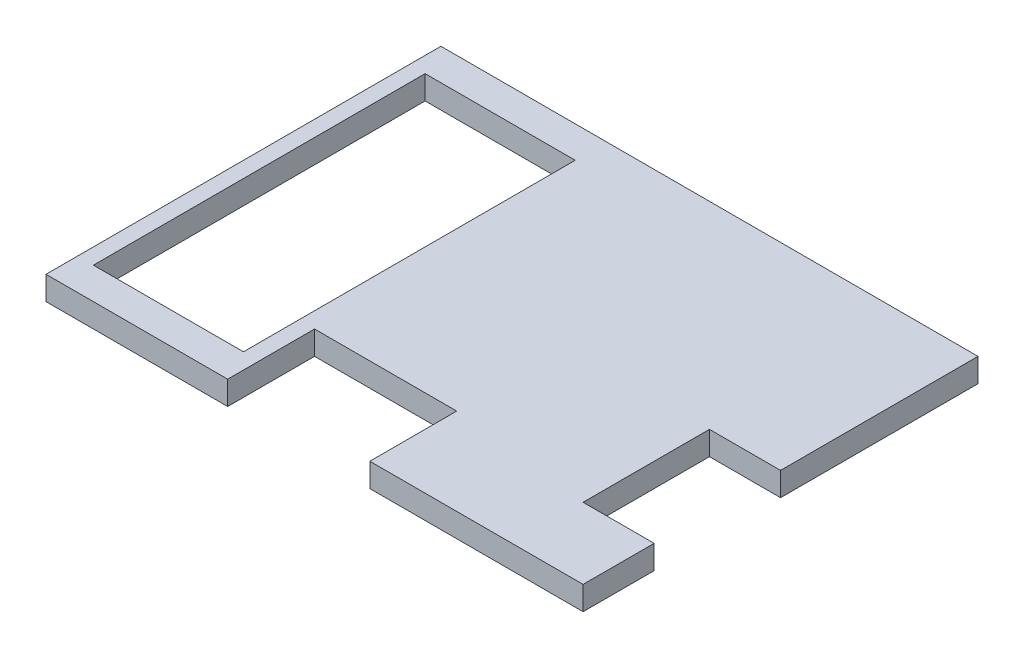
ISO-10303-21;
HEADER;
FILE_DESCRIPTION(('STEP AP214'),'2;1');
FILE_NAME('part.step','',(''),(''),'','','');
FILE_SCHEMA(('AUTOMOTIVE_DESIGN { 1 0 10303 214 1 1 1 1 }'));
ENDSEC;
DATA;
#1=APPLICATION_CONTEXT('core data for automotive mechanical design processes');
#2=APPLICATION_PROTOCOL_DEFINITION('international standard','automotive_design',2000,#1);
#3=PRODUCT_CONTEXT('',#1,'mechanical');
#4=PRODUCT('Part','Part','',(#3));
#5=PRODUCT_RELATED_PRODUCT_CATEGORY('part','',(#4));
#6=PRODUCT_DEFINITION_FORMATION('','',#4);
#7=PRODUCT_DEFINITION_CONTEXT('part definition',#1,'design');
#8=PRODUCT_DEFINITION('design','',#6,#7);
#9=PRODUCT_DEFINITION_SHAPE('','',#8);
#10=(LENGTH_UNIT() NAMED_UNIT(*) SI_UNIT(.MILLI.,.METRE.));
#11=(NAMED_UNIT(*) PLANE_ANGLE_UNIT() SI_UNIT($,.RADIAN.));
#12=(NAMED_UNIT(*) SI_UNIT($,.STERADIAN.) SOLID_ANGLE_UNIT());
#13=UNCERTAINTY_MEASURE_WITH_UNIT(LENGTH_MEASURE(1.E-05),#10,'distance_accuracy_value','');
#14=(GEOMETRIC_REPRESENTATION_CONTEXT(3) GLOBAL_UNCERTAINTY_ASSIGNED_CONTEXT((#13)) GLOBAL_UNIT_ASSIGNED_CONTEXT((#10,
#11,#12)) REPRESENTATION_CONTEXT('',''));
#15=CARTESIAN_POINT('',(0.,0.,0.));
#16=DIRECTION('',(0.,0.,1.));
#17=DIRECTION('',(1.,0.,0.));
#18=AXIS2_PLACEMENT_3D('',#15,#16,#17);
#19=CARTESIAN_POINT('',(0.,3.,0.));
#20=DIRECTION('',(0.,1.,0.));
#21=DIRECTION('',(0.,0.,1.));
#22=AXIS2_PLACEMENT_3D('',#19,#20,#21);
#23=PLANE('',#22);
#24=DIRECTION('',(0.,0.,-1.));
#25=VECTOR('',#24,1.);
#26=CARTESIAN_POINT('',(34.,3.,16.));
#27=LINE('',#26,#25);
#28=CARTESIAN_POINT('',(34.,3.,25.));
#29=VERTEX_POINT('',#28);
#30=CARTESIAN_POINT('',(34.,3.,16.));
#31=VERTEX_POINT('',#30);
#32=EDGE_CURVE('E182',#29,#31,#27,.T.);
#33=ORIENTED_EDGE('',*,*,#32,.T.);
#34=DIRECTION('',(-1.,0.,0.));
#35=VECTOR('',#34,1.);
#36=CARTESIAN_POINT('',(34.,3.,16.));
#37=LINE('',#36,#35);
#38=CARTESIAN_POINT('',(25.,3.,16.));
#39=VERTEX_POINT('',#38);
#40=EDGE_CURVE('E185',#31,#39,#37,.T.);
#41=ORIENTED_EDGE('',*,*,#40,.T.);
#42=DIRECTION('',(0.,0.,-1.));
#43=VECTOR('',#42,1.);
#44=CARTESIAN_POINT('',(25.,3.,0.));
#45=LINE('',#44,#43);
#46=CARTESIAN_POINT('',(25.,3.,0.));
#47=VERTEX_POINT('',#46);
#48=EDGE_CURVE('E188',#39,#47,#45,.T.);
#49=ORIENTED_EDGE('',*,*,#48,.T.);
#50=DIRECTION('',(1.,0.,0.));
#51=VECTOR('',#50,1.);
#52=CARTESIAN_POINT('',(34.,3.,0.));
#53=LINE('',#52,#51);
#54=CARTESIAN_POINT('',(34.,3.,0.));
#55=VERTEX_POINT('',#54);
#56=EDGE_CURVE('E190',#47,#55,#53,.T.);
#57=ORIENTED_EDGE('',*,*,#56,.T.);
#58=DIRECTION('',(0.,0.,-1.));
#59=VECTOR('',#58,1.);
#60=CARTESIAN_POINT('',(34.,3.,-25.));
#61=LINE('',#60,#59);
#62=CARTESIAN_POINT('',(34.,3.,-25.));
#63=VERTEX_POINT('',#62);
#64=EDGE_CURVE('E192',#55,#63,#61,.T.);
#65=ORIENTED_EDGE('',*,*,#64,.T.);
#66=DIRECTION('',(-1.,0.,0.));
#67=VECTOR('',#66,1.);
#68=CARTESIAN_POINT('',(-34.,3.,-25.));
#69=LINE('',#68,#67);
#70=CARTESIAN_POINT('',(-34.,3.,-25.));
#71=VERTEX_POINT('',#70);
#72=EDGE_CURVE('E194',#63,#71,#69,.T.);
#73=ORIENTED_EDGE('',*,*,#72,.T.);
#74=DIRECTION('',(0.,0.,1.));
#75=VECTOR('',#74,1.);
#76=CARTESIAN_POINT('',(-34.,3.,-25.));
#77=LINE('',#76,#75);
#78=CARTESIAN_POINT('',(-34.,3.,25.));
#79=VERTEX_POINT('',#78);
#80=EDGE_CURVE('E196',#71,#79,#77,.T.);
#81=ORIENTED_EDGE('',*,*,#80,.T.);
#82=DIRECTION('',(1.,0.,0.));
#83=VECTOR('',#82,1.);
#84=CARTESIAN_POINT('',(-34.,3.,25.));
#85=LINE('',#84,#83);
#86=CARTESIAN_POINT('',(-11.,3.,25.));
#87=VERTEX_POINT('',#86);
#88=EDGE_CURVE('E198',#79,#87,#85,.T.);
#89=ORIENTED_EDGE('',*,*,#88,.T.);
#90=DIRECTION('',(0.,0.,-1.));
#91=VECTOR('',#90,1.);
#92=CARTESIAN_POINT('',(-11.,3.,25.));
#93=LINE('',#92,#91);
#94=CARTESIAN_POINT('',(-11.,3.,14.));
#95=VERTEX_POINT('',#94);
#96=EDGE_CURVE('E200',#87,#95,#93,.T.);
#97=ORIENTED_EDGE('',*,*,#96,.T.);
#98=DIRECTION('',(1.,0.,0.));
#99=VECTOR('',#98,1.);
#100=CARTESIAN_POINT('',(7.,3.,14.));
#101=LINE('',#100,#99);
#102=CARTESIAN_POINT('',(7.,3.,14.));
#103=VERTEX_POINT('',#102);
#104=EDGE_CURVE('E202',#95,#103,#101,.T.);
#105=ORIENTED_EDGE('',*,*,#104,.T.);
#106=DIRECTION('',(0.,0.,1.));
#107=VECTOR('',#106,1.);
#108=CARTESIAN_POINT('',(7.,3.,25.));
#109=LINE('',#108,#107);
#110=CARTESIAN_POINT('',(7.,3.,25.));
#111=VERTEX_POINT('',#110);
#112=EDGE_CURVE('E204',#103,#111,#109,.T.);
#113=ORIENTED_EDGE('',*,*,#112,.T.);
#114=DIRECTION('',(1.,0.,0.));
#115=VECTOR('',#114,1.);
#116=CARTESIAN_POINT('',(7.,3.,25.));
#117=LINE('',#116,#115);
#118=EDGE_CURVE('E206',#111,#29,#117,.T.);
#119=ORIENTED_EDGE('',*,*,#118,.T.);
#120=EDGE_LOOP('',(#33,#41,#49,#57,#65,#73,#81,#89,#97,#105,#113,#119));
#121=FACE_BOUND('',#120,.T.);
#122=DIRECTION('',(-1.,0.,0.));
#123=VECTOR('',#122,1.);
#124=CARTESIAN_POINT('',(-32.,3.,-21.));
#125=LINE('',#124,#123);
#126=CARTESIAN_POINT('',(-13.,3.,-21.));
#127=VERTEX_POINT('',#126);
#128=CARTESIAN_POINT('',(-32.,3.,-21.));
#129=VERTEX_POINT('',#128);
#130=EDGE_CURVE('E154',#127,#129,#125,.T.);
#131=ORIENTED_EDGE('',*,*,#130,.F.);
#132=DIRECTION('',(0.,0.,-1.));
#133=VECTOR('',#132,1.);
#134=CARTESIAN_POINT('',(-13.,3.,-21.));
#135=LINE('',#134,#133);
#136=CARTESIAN_POINT('',(-13.,3.,21.));
#137=VERTEX_POINT('',#136);
#138=EDGE_CURVE('E146',#137,#127,#135,.T.);
#139=ORIENTED_EDGE('',*,*,#138,.F.);
#140=DIRECTION('',(1.,0.,0.));
#141=VECTOR('',#140,1.);
#142=CARTESIAN_POINT('',(-32.,3.,21.));
#143=LINE('',#142,#141);
#144=CARTESIAN_POINT('',(-32.,3.,21.));
#145=VERTEX_POINT('',#144);
#146=EDGE_CURVE('E168',#145,#137,#143,.T.);
#147=ORIENTED_EDGE('',*,*,#146,.F.);
#148=DIRECTION('',(0.,0.,1.));
#149=VECTOR('',#148,1.);
#150=CARTESIAN_POINT('',(-32.,3.,-21.));
#151=LINE('',#150,#149);
#152=EDGE_CURVE('E166',#129,#145,#151,.T.);
#153=ORIENTED_EDGE('',*,*,#152,.F.);
#154=EDGE_LOOP('',(#131,#139,#147,#153));
#155=FACE_BOUND('',#154,.T.);
#156=ADVANCED_FACE('F33',(#121,#155),#23,.T.);
#157=CARTESIAN_POINT('',(0.,0.,0.));
#158=DIRECTION('',(0.,1.,0.));
#159=DIRECTION('',(0.,0.,1.));
#160=AXIS2_PLACEMENT_3D('',#157,#158,#159);
#161=PLANE('',#160);
#162=DIRECTION('',(0.,0.,-1.));
#163=VECTOR('',#162,1.);
#164=CARTESIAN_POINT('',(34.,0.,16.));
#165=LINE('',#164,#163);
#166=CARTESIAN_POINT('',(34.,0.,25.));
#167=VERTEX_POINT('',#166);
#168=CARTESIAN_POINT('',(34.,0.,16.));
#169=VERTEX_POINT('',#168);
#170=EDGE_CURVE('E162',#167,#169,#165,.T.);
#171=ORIENTED_EDGE('',*,*,#170,.F.);
#172=DIRECTION('',(1.,0.,0.));
#173=VECTOR('',#172,1.);
#174=CARTESIAN_POINT('',(7.,0.,25.));
#175=LINE('',#174,#173);
#176=CARTESIAN_POINT('',(7.,0.,25.));
#177=VERTEX_POINT('',#176);
#178=EDGE_CURVE('E186',#177,#167,#175,.T.);
#179=ORIENTED_EDGE('',*,*,#178,.F.);
#180=DIRECTION('',(0.,0.,1.));
#181=VECTOR('',#180,1.);
#182=CARTESIAN_POINT('',(7.,0.,25.));
#183=LINE('',#182,#181);
#184=CARTESIAN_POINT('',(7.,0.,14.));
#185=VERTEX_POINT('',#184);
#186=EDGE_CURVE('E229',#185,#177,#183,.T.);
#187=ORIENTED_EDGE('',*,*,#186,.F.);
#188=DIRECTION('',(1.,0.,0.));
#189=VECTOR('',#188,1.);
#190=CARTESIAN_POINT('',(7.,0.,14.));
#191=LINE('',#190,#189);
#192=CARTESIAN_POINT('',(-11.,0.,14.));
#193=VERTEX_POINT('',#192);
#194=EDGE_CURVE('E227',#193,#185,#191,.T.);
#195=ORIENTED_EDGE('',*,*,#194,.F.);
#196=DIRECTION('',(0.,0.,-1.));
#197=VECTOR('',#196,1.);
#198=CARTESIAN_POINT('',(-11.,0.,25.));
#199=LINE('',#198,#197);
#200=CARTESIAN_POINT('',(-11.,0.,25.));
#201=VERTEX_POINT('',#200);
#202=EDGE_CURVE('E225',#201,#193,#199,.T.);
#203=ORIENTED_EDGE('',*,*,#202,.F.);
#204=DIRECTION('',(1.,0.,0.));
#205=VECTOR('',#204,1.);
#206=CARTESIAN_POINT('',(-34.,0.,25.));
#207=LINE('',#206,#205);
#208=CARTESIAN_POINT('',(-34.,0.,25.));
#209=VERTEX_POINT('',#208);
#210=EDGE_CURVE('E223',#209,#201,#207,.T.);
#211=ORIENTED_EDGE('',*,*,#210,.F.);
#212=DIRECTION('',(0.,0.,1.));
#213=VECTOR('',#212,1.);
#214=CARTESIAN_POINT('',(-34.,0.,-25.));
#215=LINE('',#214,#213);
#216=CARTESIAN_POINT('',(-34.,0.,-25.));
#217=VERTEX_POINT('',#216);
#218=EDGE_CURVE('E221',#217,#209,#215,.T.);
#219=ORIENTED_EDGE('',*,*,#218,.F.);
#220=DIRECTION('',(-1.,0.,0.));
#221=VECTOR('',#220,1.);
#222=CARTESIAN_POINT('',(-34.,0.,-25.));
#223=LINE('',#222,#221);
#224=CARTESIAN_POINT('',(34.,0.,-25.));
#225=VERTEX_POINT('',#224);
#226=EDGE_CURVE('E219',#225,#217,#223,.T.);
#227=ORIENTED_EDGE('',*,*,#226,.F.);
#228=DIRECTION('',(0.,0.,-1.));
#229=VECTOR('',#228,1.);
#230=CARTESIAN_POINT('',(34.,0.,-25.));
#231=LINE('',#230,#229);
#232=CARTESIAN_POINT('',(34.,0.,0.));
#233=VERTEX_POINT('',#232);
#234=EDGE_CURVE('E217',#233,#225,#231,.T.);
#235=ORIENTED_EDGE('',*,*,#234,.F.);
#236=DIRECTION('',(1.,0.,0.));
#237=VECTOR('',#236,1.);
#238=CARTESIAN_POINT('',(34.,0.,0.));
#239=LINE('',#238,#237);
#240=CARTESIAN_POINT('',(25.,0.,0.));
#241=VERTEX_POINT('',#240);
#242=EDGE_CURVE('E215',#241,#233,#239,.T.);
#243=ORIENTED_EDGE('',*,*,#242,.F.);
#244=DIRECTION('',(0.,0.,-1.));
#245=VECTOR('',#244,1.);
#246=CARTESIAN_POINT('',(25.,0.,0.));
#247=LINE('',#246,#245);
#248=CARTESIAN_POINT('',(25.,0.,16.));
#249=VERTEX_POINT('',#248);
#250=EDGE_CURVE('E213',#249,#241,#247,.T.);
#251=ORIENTED_EDGE('',*,*,#250,.F.);
#252=DIRECTION('',(-1.,0.,0.));
#253=VECTOR('',#252,1.);
#254=CARTESIAN_POINT('',(34.,0.,16.));
#255=LINE('',#254,#253);
#256=EDGE_CURVE('E211',#169,#249,#255,.T.);
#257=ORIENTED_EDGE('',*,*,#256,.F.);
#258=EDGE_LOOP('',(#171,#179,#187,#195,#203,#211,#219,#227,#235,#243,#251,#257));
#259=FACE_BOUND('',#258,.T.);
#260=DIRECTION('',(0.,0.,-1.));
#261=VECTOR('',#260,1.);
#262=CARTESIAN_POINT('',(-13.,0.,-21.));
#263=LINE('',#262,#261);
#264=CARTESIAN_POINT('',(-13.,0.,21.));
#265=VERTEX_POINT('',#264);
#266=CARTESIAN_POINT('',(-13.,0.,-21.));
#267=VERTEX_POINT('',#266);
#268=EDGE_CURVE('E56',#265,#267,#263,.T.);
#269=ORIENTED_EDGE('',*,*,#268,.T.);
#270=DIRECTION('',(-1.,0.,0.));
#271=VECTOR('',#270,1.);
#272=CARTESIAN_POINT('',(-32.,0.,-21.));
#273=LINE('',#272,#271);
#274=CARTESIAN_POINT('',(-32.,0.,-21.));
#275=VERTEX_POINT('',#274);
#276=EDGE_CURVE('E161',#267,#275,#273,.T.);
#277=ORIENTED_EDGE('',*,*,#276,.T.);
#278=DIRECTION('',(0.,0.,1.));
#279=VECTOR('',#278,1.);
#280=CARTESIAN_POINT('',(-32.,0.,-21.));
#281=LINE('',#280,#279);
#282=CARTESIAN_POINT('',(-32.,0.,21.));
#283=VERTEX_POINT('',#282);
#284=EDGE_CURVE('E174',#275,#283,#281,.T.);
#285=ORIENTED_EDGE('',*,*,#284,.T.);
#286=DIRECTION('',(1.,0.,0.));
#287=VECTOR('',#286,1.);
#288=CARTESIAN_POINT('',(-32.,0.,21.));
#289=LINE('',#288,#287);
#290=EDGE_CURVE('E155',#283,#265,#289,.T.);
#291=ORIENTED_EDGE('',*,*,#290,.T.);
#292=EDGE_LOOP('',(#269,#277,#285,#291));
#293=FACE_BOUND('',#292,.T.);
#294=ADVANCED_FACE('F271',(#259,#293),#161,.F.);
#295=CARTESIAN_POINT('',(34.,3.,16.));
#296=DIRECTION('',(-1.,0.,0.));
#297=DIRECTION('',(0.,0.,1.));
#298=AXIS2_PLACEMENT_3D('',#295,#296,#297);
#299=PLANE('',#298);
#300=ORIENTED_EDGE('',*,*,#170,.T.);
#301=DIRECTION('',(0.,-1.,0.));
#302=VECTOR('',#301,1.);
#303=CARTESIAN_POINT('',(34.,3.,16.));
#304=LINE('',#303,#302);
#305=EDGE_CURVE('E11',#31,#169,#304,.T.);
#306=ORIENTED_EDGE('',*,*,#305,.F.);
#307=ORIENTED_EDGE('',*,*,#32,.F.);
#308=DIRECTION('',(0.,-1.,0.));
#309=VECTOR('',#308,1.);
#310=CARTESIAN_POINT('',(34.,3.,25.));
#311=LINE('',#310,#309);
#312=EDGE_CURVE('E208',#29,#167,#311,.T.);
#313=ORIENTED_EDGE('',*,*,#312,.T.);
#314=EDGE_LOOP('',(#300,#306,#307,#313));
#315=FACE_BOUND('',#314,.T.);
#316=ADVANCED_FACE('F35',(#315),#299,.F.);
#317=CARTESIAN_POINT('',(34.,3.,16.));
#318=DIRECTION('',(0.,0.,1.));
#319=DIRECTION('',(1.,0.,0.));
#320=AXIS2_PLACEMENT_3D('',#317,#318,#319);
#321=PLANE('',#320);
#322=ORIENTED_EDGE('',*,*,#256,.T.);
#323=DIRECTION('',(0.,-1.,0.));
#324=VECTOR('',#323,1.);
#325=CARTESIAN_POINT('',(25.,3.,16.));
#326=LINE('',#325,#324);
#327=EDGE_CURVE('E41',#39,#249,#326,.T.);
#328=ORIENTED_EDGE('',*,*,#327,.F.);
#329=ORIENTED_EDGE('',*,*,#40,.F.);
#330=ORIENTED_EDGE('',*,*,#305,.T.);
#331=EDGE_LOOP('',(#322,#328,#329,#330));
#332=FACE_BOUND('',#331,.T.);
#333=ADVANCED_FACE('F288',(#332),#321,.F.);
#334=CARTESIAN_POINT('',(25.,3.,0.));
#335=DIRECTION('',(-1.,0.,0.));
#336=DIRECTION('',(0.,0.,1.));
#337=AXIS2_PLACEMENT_3D('',#334,#335,#336);
#338=PLANE('',#337);
#339=ORIENTED_EDGE('',*,*,#250,.T.);
#340=DIRECTION('',(0.,-1.,0.));
#341=VECTOR('',#340,1.);
#342=CARTESIAN_POINT('',(25.,3.,0.));
#343=LINE('',#342,#341);
#344=EDGE_CURVE('E258',#47,#241,#343,.T.);
#345=ORIENTED_EDGE('',*,*,#344,.F.);
#346=ORIENTED_EDGE('',*,*,#48,.F.);
#347=ORIENTED_EDGE('',*,*,#327,.T.);
#348=EDGE_LOOP('',(#339,#345,#346,#347));
#349=FACE_BOUND('',#348,.T.);
#350=ADVANCED_FACE('F265',(#349),#338,.F.);
#351=CARTESIAN_POINT('',(34.,3.,0.));
#352=DIRECTION('',(0.,0.,-1.));
#353=DIRECTION('',(-1.,0.,0.));
#354=AXIS2_PLACEMENT_3D('',#351,#352,#353);
#355=PLANE('',#354);
#356=ORIENTED_EDGE('',*,*,#242,.T.);
#357=DIRECTION('',(0.,-1.,0.));
#358=VECTOR('',#357,1.);
#359=CARTESIAN_POINT('',(34.,3.,0.));
#360=LINE('',#359,#358);
#361=EDGE_CURVE('E255',#55,#233,#360,.T.);
#362=ORIENTED_EDGE('',*,*,#361,.F.);
#363=ORIENTED_EDGE('',*,*,#56,.F.);
#364=ORIENTED_EDGE('',*,*,#344,.T.);
#365=EDGE_LOOP('',(#356,#362,#363,#364));
#366=FACE_BOUND('',#365,.T.);
#367=ADVANCED_FACE('F277',(#366),#355,.F.);
#368=CARTESIAN_POINT('',(34.,3.,-25.));
#369=DIRECTION('',(-1.,0.,0.));
#370=DIRECTION('',(0.,0.,1.));
#371=AXIS2_PLACEMENT_3D('',#368,#369,#370);
#372=PLANE('',#371);
#373=ORIENTED_EDGE('',*,*,#234,.T.);
#374=DIRECTION('',(0.,-1.,0.));
#375=VECTOR('',#374,1.);
#376=CARTESIAN_POINT('',(34.,3.,-25.));
#377=LINE('',#376,#375);
#378=EDGE_CURVE('E252',#63,#225,#377,.T.);
#379=ORIENTED_EDGE('',*,*,#378,.F.);
#380=ORIENTED_EDGE('',*,*,#64,.F.);
#381=ORIENTED_EDGE('',*,*,#361,.T.);
#382=EDGE_LOOP('',(#373,#379,#380,#381));
#383=FACE_BOUND('',#382,.T.);
#384=ADVANCED_FACE('F281',(#383),#372,.F.);
#385=CARTESIAN_POINT('',(-34.,3.,-25.));
#386=DIRECTION('',(0.,0.,1.));
#387=DIRECTION('',(1.,0.,0.));
#388=AXIS2_PLACEMENT_3D('',#385,#386,#387);
#389=PLANE('',#388);
#390=ORIENTED_EDGE('',*,*,#226,.T.);
#391=DIRECTION('',(0.,-1.,0.));
#392=VECTOR('',#391,1.);
#393=CARTESIAN_POINT('',(-34.,3.,-25.));
#394=LINE('',#393,#392);
#395=EDGE_CURVE('E249',#71,#217,#394,.T.);
#396=ORIENTED_EDGE('',*,*,#395,.F.);
#397=ORIENTED_EDGE('',*,*,#72,.F.);
#398=ORIENTED_EDGE('',*,*,#378,.T.);
#399=EDGE_LOOP('',(#390,#396,#397,#398));
#400=FACE_BOUND('',#399,.T.);
#401=ADVANCED_FACE('F321',(#400),#389,.F.);
#402=CARTESIAN_POINT('',(-34.,3.,-25.));
#403=DIRECTION('',(1.,0.,0.));
#404=DIRECTION('',(0.,0.,-1.));
#405=AXIS2_PLACEMENT_3D('',#402,#403,#404);
#406=PLANE('',#405);
#407=ORIENTED_EDGE('',*,*,#218,.T.);
#408=DIRECTION('',(0.,-1.,0.));
#409=VECTOR('',#408,1.);
#410=CARTESIAN_POINT('',(-34.,3.,25.));
#411=LINE('',#410,#409);
#412=EDGE_CURVE('E246',#79,#209,#411,.T.);
#413=ORIENTED_EDGE('',*,*,#412,.F.);
#414=ORIENTED_EDGE('',*,*,#80,.F.);
#415=ORIENTED_EDGE('',*,*,#395,.T.);
#416=EDGE_LOOP('',(#407,#413,#414,#415));
#417=FACE_BOUND('',#416,.T.);
#418=ADVANCED_FACE('F319',(#417),#406,.F.);
#419=CARTESIAN_POINT('',(-34.,3.,25.));
#420=DIRECTION('',(0.,0.,-1.));
#421=DIRECTION('',(-1.,0.,0.));
#422=AXIS2_PLACEMENT_3D('',#419,#420,#421);
#423=PLANE('',#422);
#424=ORIENTED_EDGE('',*,*,#210,.T.);
#425=DIRECTION('',(0.,-1.,0.));
#426=VECTOR('',#425,1.);
#427=CARTESIAN_POINT('',(-11.,3.,25.));
#428=LINE('',#427,#426);
#429=EDGE_CURVE('E243',#87,#201,#428,.T.);
#430=ORIENTED_EDGE('',*,*,#429,.F.);
#431=ORIENTED_EDGE('',*,*,#88,.F.);
#432=ORIENTED_EDGE('',*,*,#412,.T.);
#433=EDGE_LOOP('',(#424,#430,#431,#432));
#434=FACE_BOUND('',#433,.T.);
#435=ADVANCED_FACE('F315',(#434),#423,.F.);
#436=CARTESIAN_POINT('',(-11.,3.,25.));
#437=DIRECTION('',(-1.,0.,0.));
#438=DIRECTION('',(0.,0.,1.));
#439=AXIS2_PLACEMENT_3D('',#436,#437,#438);
#440=PLANE('',#439);
#441=ORIENTED_EDGE('',*,*,#202,.T.);
#442=DIRECTION('',(0.,-1.,0.));
#443=VECTOR('',#442,1.);
#444=CARTESIAN_POINT('',(-11.,3.,14.));
#445=LINE('',#444,#443);
#446=EDGE_CURVE('E240',#95,#193,#445,.T.);
#447=ORIENTED_EDGE('',*,*,#446,.F.);
#448=ORIENTED_EDGE('',*,*,#96,.F.);
#449=ORIENTED_EDGE('',*,*,#429,.T.);
#450=EDGE_LOOP('',(#441,#447,#448,#449));
#451=FACE_BOUND('',#450,.T.);
#452=ADVANCED_FACE('F310',(#451),#440,.F.);
#453=CARTESIAN_POINT('',(7.,3.,14.));
#454=DIRECTION('',(0.,0.,-1.));
#455=DIRECTION('',(-1.,0.,0.));
#456=AXIS2_PLACEMENT_3D('',#453,#454,#455);
#457=PLANE('',#456);
#458=ORIENTED_EDGE('',*,*,#194,.T.);
#459=DIRECTION('',(0.,-1.,0.));
#460=VECTOR('',#459,1.);
#461=CARTESIAN_POINT('',(7.,3.,14.));
#462=LINE('',#461,#460);
#463=EDGE_CURVE('E237',#103,#185,#462,.T.);
#464=ORIENTED_EDGE('',*,*,#463,.F.);
#465=ORIENTED_EDGE('',*,*,#104,.F.);
#466=ORIENTED_EDGE('',*,*,#446,.T.);
#467=EDGE_LOOP('',(#458,#464,#465,#466));
#468=FACE_BOUND('',#467,.T.);
#469=ADVANCED_FACE('F304',(#468),#457,.F.);
#470=CARTESIAN_POINT('',(7.,3.,25.));
#471=DIRECTION('',(1.,0.,0.));
#472=DIRECTION('',(0.,0.,-1.));
#473=AXIS2_PLACEMENT_3D('',#470,#471,#472);
#474=PLANE('',#473);
#475=ORIENTED_EDGE('',*,*,#186,.T.);
#476=DIRECTION('',(0.,-1.,0.));
#477=VECTOR('',#476,1.);
#478=CARTESIAN_POINT('',(7.,3.,25.));
#479=LINE('',#478,#477);
#480=EDGE_CURVE('E234',#111,#177,#479,.T.);
#481=ORIENTED_EDGE('',*,*,#480,.F.);
#482=ORIENTED_EDGE('',*,*,#112,.F.);
#483=ORIENTED_EDGE('',*,*,#463,.T.);
#484=EDGE_LOOP('',(#475,#481,#482,#483));
#485=FACE_BOUND('',#484,.T.);
#486=ADVANCED_FACE('F300',(#485),#474,.F.);
#487=CARTESIAN_POINT('',(7.,3.,25.));
#488=DIRECTION('',(0.,0.,-1.));
#489=DIRECTION('',(-1.,0.,0.));
#490=AXIS2_PLACEMENT_3D('',#487,#488,#489);
#491=PLANE('',#490);
#492=ORIENTED_EDGE('',*,*,#178,.T.);
#493=ORIENTED_EDGE('',*,*,#312,.F.);
#494=ORIENTED_EDGE('',*,*,#118,.F.);
#495=ORIENTED_EDGE('',*,*,#480,.T.);
#496=EDGE_LOOP('',(#492,#493,#494,#495));
#497=FACE_BOUND('',#496,.T.);
#498=ADVANCED_FACE('F295',(#497),#491,.F.);
#499=CARTESIAN_POINT('',(-13.,3.,-21.));
#500=DIRECTION('',(-1.,0.,0.));
#501=DIRECTION('',(0.,0.,1.));
#502=AXIS2_PLACEMENT_3D('',#499,#500,#501);
#503=PLANE('',#502);
#504=ORIENTED_EDGE('',*,*,#268,.F.);
#505=DIRECTION('',(0.,-1.,0.));
#506=VECTOR('',#505,1.);
#507=CARTESIAN_POINT('',(-13.,3.,21.));
#508=LINE('',#507,#506);
#509=EDGE_CURVE('E150',#137,#265,#508,.T.);
#510=ORIENTED_EDGE('',*,*,#509,.F.);
#511=ORIENTED_EDGE('',*,*,#138,.T.);
#512=DIRECTION('',(0.,-1.,0.));
#513=VECTOR('',#512,1.);
#514=CARTESIAN_POINT('',(-13.,3.,-21.));
#515=LINE('',#514,#513);
#516=EDGE_CURVE('E149',#127,#267,#515,.T.);
#517=ORIENTED_EDGE('',*,*,#516,.T.);
#518=EDGE_LOOP('',(#504,#510,#511,#517));
#519=FACE_BOUND('',#518,.T.);
#520=ADVANCED_FACE('F148',(#519),#503,.T.);
#521=CARTESIAN_POINT('',(-32.,3.,-21.));
#522=DIRECTION('',(0.,0.,1.));
#523=DIRECTION('',(1.,0.,0.));
#524=AXIS2_PLACEMENT_3D('',#521,#522,#523);
#525=PLANE('',#524);
#526=ORIENTED_EDGE('',*,*,#276,.F.);
#527=ORIENTED_EDGE('',*,*,#516,.F.);
#528=ORIENTED_EDGE('',*,*,#130,.T.);
#529=DIRECTION('',(0.,-1.,0.));
#530=VECTOR('',#529,1.);
#531=CARTESIAN_POINT('',(-32.,3.,-21.));
#532=LINE('',#531,#530);
#533=EDGE_CURVE('E163',#129,#275,#532,.T.);
#534=ORIENTED_EDGE('',*,*,#533,.T.);
#535=EDGE_LOOP('',(#526,#527,#528,#534));
#536=FACE_BOUND('',#535,.T.);
#537=ADVANCED_FACE('F158',(#536),#525,.T.);
#538=CARTESIAN_POINT('',(-32.,3.,-21.));
#539=DIRECTION('',(1.,0.,0.));
#540=DIRECTION('',(0.,0.,-1.));
#541=AXIS2_PLACEMENT_3D('',#538,#539,#540);
#542=PLANE('',#541);
#543=ORIENTED_EDGE('',*,*,#284,.F.);
#544=ORIENTED_EDGE('',*,*,#533,.F.);
#545=ORIENTED_EDGE('',*,*,#152,.T.);
#546=DIRECTION('',(0.,-1.,0.));
#547=VECTOR('',#546,1.);
#548=CARTESIAN_POINT('',(-32.,3.,21.));
#549=LINE('',#548,#547);
#550=EDGE_CURVE('E48',#145,#283,#549,.T.);
#551=ORIENTED_EDGE('',*,*,#550,.T.);
#552=EDGE_LOOP('',(#543,#544,#545,#551));
#553=FACE_BOUND('',#552,.T.);
#554=ADVANCED_FACE('F379',(#553),#542,.T.);
#555=CARTESIAN_POINT('',(-32.,3.,21.));
#556=DIRECTION('',(0.,0.,-1.));
#557=DIRECTION('',(-1.,0.,0.));
#558=AXIS2_PLACEMENT_3D('',#555,#556,#557);
#559=PLANE('',#558);
#560=ORIENTED_EDGE('',*,*,#290,.F.);
#561=ORIENTED_EDGE('',*,*,#550,.F.);
#562=ORIENTED_EDGE('',*,*,#146,.T.);
#563=ORIENTED_EDGE('',*,*,#509,.T.);
#564=EDGE_LOOP('',(#560,#561,#562,#563));
#565=FACE_BOUND('',#564,.T.);
#566=ADVANCED_FACE('F385',(#565),#559,.T.);
#567=CLOSED_SHELL('',(#156,#294,#316,#333,#350,#367,#384,#401,#418,#435,#452,#469,#486,#498,
#520,#537,#554,#566));
#568=MANIFOLD_SOLID_BREP('B2',#567);
#569=ADVANCED_BREP_SHAPE_REPRESENTATION('',(#18,#568),#14);
#570=SHAPE_DEFINITION_REPRESENTATION(#9,#569);
ENDSEC;
END-ISO-10303-21;
